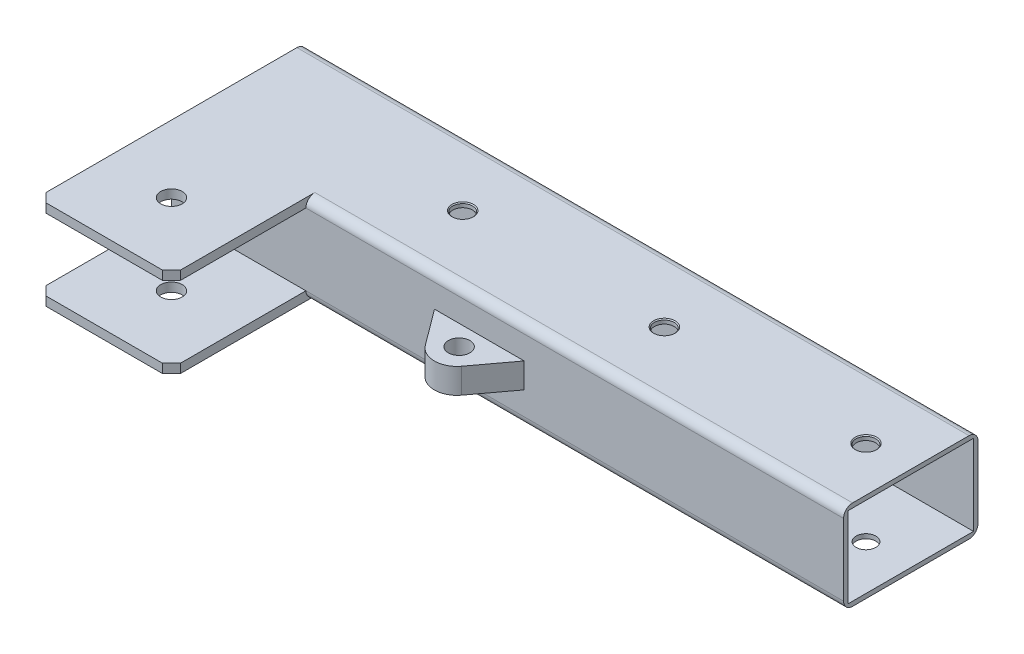
ISO-10303-21;
HEADER;
FILE_DESCRIPTION(('STEP AP214'),'2;1');
FILE_NAME('part.step','',(''),(''),'','','');
FILE_SCHEMA(('AUTOMOTIVE_DESIGN { 1 0 10303 214 1 1 1 1 }'));
ENDSEC;
DATA;
#1=APPLICATION_CONTEXT('core data for automotive mechanical design processes');
#2=APPLICATION_PROTOCOL_DEFINITION('international standard','automotive_design',2000,#1);
#3=PRODUCT_CONTEXT('',#1,'mechanical');
#4=PRODUCT('Part','Part','',(#3));
#5=PRODUCT_RELATED_PRODUCT_CATEGORY('part','',(#4));
#6=PRODUCT_DEFINITION_FORMATION('','',#4);
#7=PRODUCT_DEFINITION_CONTEXT('part definition',#1,'design');
#8=PRODUCT_DEFINITION('design','',#6,#7);
#9=PRODUCT_DEFINITION_SHAPE('','',#8);
#10=(LENGTH_UNIT() NAMED_UNIT(*) SI_UNIT(.MILLI.,.METRE.));
#11=(NAMED_UNIT(*) PLANE_ANGLE_UNIT() SI_UNIT($,.RADIAN.));
#12=(NAMED_UNIT(*) SI_UNIT($,.STERADIAN.) SOLID_ANGLE_UNIT());
#13=UNCERTAINTY_MEASURE_WITH_UNIT(LENGTH_MEASURE(1.E-05),#10,'distance_accuracy_value','');
#14=(GEOMETRIC_REPRESENTATION_CONTEXT(3) GLOBAL_UNCERTAINTY_ASSIGNED_CONTEXT((#13)) GLOBAL_UNIT_ASSIGNED_CONTEXT((#10,
#11,#12)) REPRESENTATION_CONTEXT('',''));
#15=CARTESIAN_POINT('',(0.,0.,0.));
#16=DIRECTION('',(0.,0.,1.));
#17=DIRECTION('',(1.,0.,0.));
#18=AXIS2_PLACEMENT_3D('',#15,#16,#17);
#19=CARTESIAN_POINT('',(-225.,100.,75.));
#20=DIRECTION('',(0.,0.,-1.));
#21=DIRECTION('',(-1.,0.,0.));
#22=AXIS2_PLACEMENT_3D('',#19,#20,#21);
#23=PLANE('',#22);
#24=DIRECTION('',(1.,0.,0.));
#25=VECTOR('',#24,1.);
#26=CARTESIAN_POINT('',(-375.001,10.,75.));
#27=LINE('',#26,#25);
#28=CARTESIAN_POINT('',(-375.,10.,75.));
#29=VERTEX_POINT('',#28);
#30=CARTESIAN_POINT('',(-225.,9.99999999999999,75.));
#31=VERTEX_POINT('',#30);
#32=EDGE_CURVE('E356',#29,#31,#27,.T.);
#33=ORIENTED_EDGE('',*,*,#32,.T.);
#34=DIRECTION('',(1.,0.,0.));
#35=VECTOR('',#34,1.);
#36=CARTESIAN_POINT('',(375.,9.99999999999999,75.));
#37=LINE('',#36,#35);
#38=CARTESIAN_POINT('',(375.,9.99999999999999,75.));
#39=VERTEX_POINT('',#38);
#40=EDGE_CURVE('E504',#31,#39,#37,.T.);
#41=ORIENTED_EDGE('',*,*,#40,.T.);
#42=DIRECTION('',(0.,-1.,0.));
#43=VECTOR('',#42,1.);
#44=CARTESIAN_POINT('',(375.,100.,75.));
#45=LINE('',#44,#43);
#46=CARTESIAN_POINT('',(375.,90.,75.));
#47=VERTEX_POINT('',#46);
#48=EDGE_CURVE('E448',#47,#39,#45,.T.);
#49=ORIENTED_EDGE('',*,*,#48,.F.);
#50=DIRECTION('',(1.,0.,0.));
#51=VECTOR('',#50,1.);
#52=CARTESIAN_POINT('',(-225.,90.,75.));
#53=LINE('',#52,#51);
#54=CARTESIAN_POINT('',(-225.,90.,75.));
#55=VERTEX_POINT('',#54);
#56=EDGE_CURVE('E500',#47,#55,#53,.F.);
#57=ORIENTED_EDGE('',*,*,#56,.T.);
#58=DIRECTION('',(1.,0.,0.));
#59=VECTOR('',#58,1.);
#60=CARTESIAN_POINT('',(-375.001,90.,75.));
#61=LINE('',#60,#59);
#62=CARTESIAN_POINT('',(-375.,90.,75.));
#63=VERTEX_POINT('',#62);
#64=EDGE_CURVE('E355',#63,#55,#61,.T.);
#65=ORIENTED_EDGE('',*,*,#64,.F.);
#66=DIRECTION('',(0.,1.,0.));
#67=VECTOR('',#66,1.);
#68=CARTESIAN_POINT('',(-375.,0.,75.));
#69=LINE('',#68,#67);
#70=EDGE_CURVE('E347',#29,#63,#69,.T.);
#71=ORIENTED_EDGE('',*,*,#70,.F.);
#72=EDGE_LOOP('',(#33,#41,#49,#57,#65,#71));
#73=FACE_BOUND('',#72,.T.);
#74=DIRECTION('',(1.,0.,0.));
#75=VECTOR('',#74,1.);
#76=CARTESIAN_POINT('',(0.,36.,75.));
#77=LINE('',#76,#75);
#78=CARTESIAN_POINT('',(-81.4569140668178,36.,75.));
#79=VERTEX_POINT('',#78);
#80=CARTESIAN_POINT('',(18.5430859331822,36.,75.));
#81=VERTEX_POINT('',#80);
#82=EDGE_CURVE('E236',#79,#81,#77,.T.);
#83=ORIENTED_EDGE('',*,*,#82,.F.);
#84=DIRECTION('',(0.,1.,0.));
#85=VECTOR('',#84,1.);
#86=CARTESIAN_POINT('',(-81.4569140668178,36.,75.));
#87=LINE('',#86,#85);
#88=CARTESIAN_POINT('',(-81.4569140668178,64.,75.));
#89=VERTEX_POINT('',#88);
#90=EDGE_CURVE('E250',#79,#89,#87,.T.);
#91=ORIENTED_EDGE('',*,*,#90,.T.);
#92=DIRECTION('',(1.,0.,0.));
#93=VECTOR('',#92,1.);
#94=CARTESIAN_POINT('',(0.,64.,75.));
#95=LINE('',#94,#93);
#96=CARTESIAN_POINT('',(18.5430859331822,64.,75.));
#97=VERTEX_POINT('',#96);
#98=EDGE_CURVE('E256',#89,#97,#95,.T.);
#99=ORIENTED_EDGE('',*,*,#98,.T.);
#100=DIRECTION('',(0.,1.,0.));
#101=VECTOR('',#100,1.);
#102=CARTESIAN_POINT('',(18.5430859331822,36.,75.));
#103=LINE('',#102,#101);
#104=EDGE_CURVE('E280',#81,#97,#103,.T.);
#105=ORIENTED_EDGE('',*,*,#104,.F.);
#106=EDGE_LOOP('',(#83,#91,#99,#105));
#107=FACE_BOUND('',#106,.T.);
#108=ADVANCED_FACE('F53',(#73,#107),#23,.F.);
#109=CARTESIAN_POINT('',(-375.,100.,225.));
#110=DIRECTION('',(0.,0.,-1.));
#111=DIRECTION('',(-1.,0.,0.));
#112=AXIS2_PLACEMENT_3D('',#109,#110,#111);
#113=PLANE('',#112);
#114=DIRECTION('',(1.,0.,0.));
#115=VECTOR('',#114,1.);
#116=CARTESIAN_POINT('',(-375.,100.,225.));
#117=LINE('',#116,#115);
#118=CARTESIAN_POINT('',(-365.,100.,225.));
#119=VERTEX_POINT('',#118);
#120=CARTESIAN_POINT('',(-235.,100.,225.));
#121=VERTEX_POINT('',#120);
#122=EDGE_CURVE('E442',#119,#121,#117,.T.);
#123=ORIENTED_EDGE('',*,*,#122,.F.);
#124=DIRECTION('',(0.,-1.,0.));
#125=VECTOR('',#124,1.);
#126=CARTESIAN_POINT('',(-365.,100.,225.));
#127=LINE('',#126,#125);
#128=CARTESIAN_POINT('',(-365.,90.,225.));
#129=VERTEX_POINT('',#128);
#130=EDGE_CURVE('E562',#119,#129,#127,.T.);
#131=ORIENTED_EDGE('',*,*,#130,.T.);
#132=DIRECTION('',(1.,0.,0.));
#133=VECTOR('',#132,1.);
#134=CARTESIAN_POINT('',(-375.001,90.,225.));
#135=LINE('',#134,#133);
#136=CARTESIAN_POINT('',(-235.,90.,225.));
#137=VERTEX_POINT('',#136);
#138=EDGE_CURVE('E365',#129,#137,#135,.T.);
#139=ORIENTED_EDGE('',*,*,#138,.T.);
#140=DIRECTION('',(0.,1.,0.));
#141=VECTOR('',#140,1.);
#142=CARTESIAN_POINT('',(-235.,100.,225.));
#143=LINE('',#142,#141);
#144=EDGE_CURVE('E559',#137,#121,#143,.T.);
#145=ORIENTED_EDGE('',*,*,#144,.T.);
#146=EDGE_LOOP('',(#123,#131,#139,#145));
#147=FACE_BOUND('',#146,.T.);
#148=ADVANCED_FACE('F584',(#147),#113,.F.);
#149=CARTESIAN_POINT('',(-225.,100.,75.));
#150=DIRECTION('',(-1.,0.,0.));
#151=DIRECTION('',(0.,0.,1.));
#152=AXIS2_PLACEMENT_3D('',#149,#150,#151);
#153=PLANE('',#152);
#154=DIRECTION('',(0.,0.,-1.));
#155=VECTOR('',#154,1.);
#156=CARTESIAN_POINT('',(-225.,100.,75.));
#157=LINE('',#156,#155);
#158=CARTESIAN_POINT('',(-225.,100.,215.));
#159=VERTEX_POINT('',#158);
#160=CARTESIAN_POINT('',(-225.,100.,65.));
#161=VERTEX_POINT('',#160);
#162=EDGE_CURVE('E445',#159,#161,#157,.T.);
#163=ORIENTED_EDGE('',*,*,#162,.F.);
#164=DIRECTION('',(0.,-1.,0.));
#165=VECTOR('',#164,1.);
#166=CARTESIAN_POINT('',(-225.,100.,215.));
#167=LINE('',#166,#165);
#168=CARTESIAN_POINT('',(-225.,90.,215.));
#169=VERTEX_POINT('',#168);
#170=EDGE_CURVE('E11',#159,#169,#167,.T.);
#171=ORIENTED_EDGE('',*,*,#170,.T.);
#172=DIRECTION('',(0.,0.,-1.));
#173=VECTOR('',#172,1.);
#174=CARTESIAN_POINT('',(-225.,90.,0.));
#175=LINE('',#174,#173);
#176=EDGE_CURVE('E375',#169,#55,#175,.T.);
#177=ORIENTED_EDGE('',*,*,#176,.T.);
#178=CARTESIAN_POINT('',(-225.,90.,65.));
#179=DIRECTION('',(-1.,0.,0.));
#180=DIRECTION('',(0.,0.,1.));
#181=AXIS2_PLACEMENT_3D('',#178,#179,#180);
#182=CIRCLE('',#181,10.);
#183=EDGE_CURVE('E526',#55,#161,#182,.T.);
#184=ORIENTED_EDGE('',*,*,#183,.T.);
#185=EDGE_LOOP('',(#163,#171,#177,#184));
#186=FACE_BOUND('',#185,.T.);
#187=ADVANCED_FACE('F623',(#186),#153,.F.);
#188=CARTESIAN_POINT('',(-300.,100.,150.));
#189=DIRECTION('',(0.,-1.,0.));
#190=DIRECTION('',(0.,0.,-1.));
#191=AXIS2_PLACEMENT_3D('',#188,#189,#190);
#192=CYLINDRICAL_SURFACE('',#191,12.);
#193=CARTESIAN_POINT('',(-300.,100.,150.));
#194=DIRECTION('',(0.,1.,0.));
#195=DIRECTION('',(0.,0.,1.));
#196=AXIS2_PLACEMENT_3D('',#193,#194,#195);
#197=CIRCLE('',#196,12.);
#198=CARTESIAN_POINT('',(-300.,100.,162.));
#199=VERTEX_POINT('',#198);
#200=EDGE_CURVE('E426',#199,#199,#197,.T.);
#201=ORIENTED_EDGE('',*,*,#200,.T.);
#202=EDGE_LOOP('',(#201));
#203=FACE_BOUND('',#202,.T.);
#204=CARTESIAN_POINT('',(-300.,90.,150.));
#205=DIRECTION('',(0.,-1.,0.));
#206=DIRECTION('',(0.,0.,-1.));
#207=AXIS2_PLACEMENT_3D('',#204,#205,#206);
#208=CIRCLE('',#207,12.);
#209=CARTESIAN_POINT('',(-300.,90.,138.));
#210=VERTEX_POINT('',#209);
#211=EDGE_CURVE('E360',#210,#210,#208,.F.);
#212=ORIENTED_EDGE('',*,*,#211,.F.);
#213=EDGE_LOOP('',(#212));
#214=FACE_BOUND('',#213,.T.);
#215=ADVANCED_FACE('F717',(#203,#214),#192,.F.);
#216=CARTESIAN_POINT('',(0.,100.,0.));
#217=DIRECTION('',(0.,-1.,0.));
#218=DIRECTION('',(0.,0.,-1.));
#219=AXIS2_PLACEMENT_3D('',#216,#217,#218);
#220=PLANE('',#219);
#221=CARTESIAN_POINT('',(100.,100.,0.));
#222=DIRECTION('',(0.,1.,0.));
#223=DIRECTION('',(0.,0.,1.));
#224=AXIS2_PLACEMENT_3D('',#221,#222,#223);
#225=CIRCLE('',#224,12.025);
#226=CARTESIAN_POINT('',(100.,100.,12.025));
#227=VERTEX_POINT('',#226);
#228=EDGE_CURVE('E279',#227,#227,#225,.T.);
#229=ORIENTED_EDGE('',*,*,#228,.F.);
#230=EDGE_LOOP('',(#229));
#231=FACE_BOUND('',#230,.T.);
#232=CARTESIAN_POINT('',(325.,100.,0.));
#233=DIRECTION('',(0.,1.,0.));
#234=DIRECTION('',(0.,0.,1.));
#235=AXIS2_PLACEMENT_3D('',#232,#233,#234);
#236=CIRCLE('',#235,12.025);
#237=CARTESIAN_POINT('',(325.,100.,12.025));
#238=VERTEX_POINT('',#237);
#239=EDGE_CURVE('E300',#238,#238,#236,.T.);
#240=ORIENTED_EDGE('',*,*,#239,.F.);
#241=EDGE_LOOP('',(#240));
#242=FACE_BOUND('',#241,.T.);
#243=CARTESIAN_POINT('',(-125.,100.,0.));
#244=DIRECTION('',(0.,1.,0.));
#245=DIRECTION('',(0.,0.,1.));
#246=AXIS2_PLACEMENT_3D('',#243,#244,#245);
#247=CIRCLE('',#246,12.025);
#248=CARTESIAN_POINT('',(-125.,100.,12.025));
#249=VERTEX_POINT('',#248);
#250=EDGE_CURVE('E320',#249,#249,#247,.T.);
#251=ORIENTED_EDGE('',*,*,#250,.F.);
#252=EDGE_LOOP('',(#251));
#253=FACE_BOUND('',#252,.T.);
#254=DIRECTION('',(0.,0.,1.));
#255=VECTOR('',#254,1.);
#256=CARTESIAN_POINT('',(-375.,100.,-75.));
#257=LINE('',#256,#255);
#258=CARTESIAN_POINT('',(-375.,100.,-65.));
#259=VERTEX_POINT('',#258);
#260=CARTESIAN_POINT('',(-375.,100.,215.));
#261=VERTEX_POINT('',#260);
#262=EDGE_CURVE('E437',#259,#261,#257,.T.);
#263=ORIENTED_EDGE('',*,*,#262,.T.);
#264=DIRECTION('',(-0.707106781186544,0.,-0.707106781186551));
#265=VECTOR('',#264,1.);
#266=CARTESIAN_POINT('',(-365.,100.,225.));
#267=LINE('',#266,#265);
#268=EDGE_CURVE('E64',#261,#119,#267,.F.);
#269=ORIENTED_EDGE('',*,*,#268,.T.);
#270=ORIENTED_EDGE('',*,*,#122,.T.);
#271=DIRECTION('',(-0.707106781186551,0.,0.707106781186544));
#272=VECTOR('',#271,1.);
#273=CARTESIAN_POINT('',(-225.,100.,215.));
#274=LINE('',#273,#272);
#275=EDGE_CURVE('E79',#121,#159,#274,.F.);
#276=ORIENTED_EDGE('',*,*,#275,.T.);
#277=ORIENTED_EDGE('',*,*,#162,.T.);
#278=DIRECTION('',(1.,0.,0.));
#279=VECTOR('',#278,1.);
#280=CARTESIAN_POINT('',(0.,100.,65.));
#281=LINE('',#280,#279);
#282=CARTESIAN_POINT('',(375.,100.,65.));
#283=VERTEX_POINT('',#282);
#284=EDGE_CURVE('E518',#161,#283,#281,.T.);
#285=ORIENTED_EDGE('',*,*,#284,.T.);
#286=DIRECTION('',(0.,0.,-1.));
#287=VECTOR('',#286,1.);
#288=CARTESIAN_POINT('',(375.,100.,75.));
#289=LINE('',#288,#287);
#290=CARTESIAN_POINT('',(375.,100.,-65.));
#291=VERTEX_POINT('',#290);
#292=EDGE_CURVE('E434',#283,#291,#289,.T.);
#293=ORIENTED_EDGE('',*,*,#292,.T.);
#294=DIRECTION('',(-1.,0.,0.));
#295=VECTOR('',#294,1.);
#296=CARTESIAN_POINT('',(0.,100.,-65.));
#297=LINE('',#296,#295);
#298=EDGE_CURVE('E496',#291,#259,#297,.T.);
#299=ORIENTED_EDGE('',*,*,#298,.T.);
#300=EDGE_LOOP('',(#263,#269,#270,#276,#277,#285,#293,#299));
#301=FACE_BOUND('',#300,.T.);
#302=ORIENTED_EDGE('',*,*,#200,.F.);
#303=EDGE_LOOP('',(#302));
#304=FACE_BOUND('',#303,.T.);
#305=ADVANCED_FACE('F577',(#231,#242,#253,#301,#304),#220,.F.);
#306=CARTESIAN_POINT('',(0.,0.,0.));
#307=DIRECTION('',(0.,-1.,0.));
#308=DIRECTION('',(0.,0.,-1.));
#309=AXIS2_PLACEMENT_3D('',#306,#307,#308);
#310=PLANE('',#309);
#311=CARTESIAN_POINT('',(100.,0.,0.));
#312=DIRECTION('',(0.,1.,0.));
#313=DIRECTION('',(0.,0.,1.));
#314=AXIS2_PLACEMENT_3D('',#311,#312,#313);
#315=CIRCLE('',#314,11.);
#316=CARTESIAN_POINT('',(100.,0.,11.));
#317=VERTEX_POINT('',#316);
#318=EDGE_CURVE('E292',#317,#317,#315,.T.);
#319=ORIENTED_EDGE('',*,*,#318,.T.);
#320=EDGE_LOOP('',(#319));
#321=FACE_BOUND('',#320,.T.);
#322=CARTESIAN_POINT('',(325.,0.,0.));
#323=DIRECTION('',(0.,1.,0.));
#324=DIRECTION('',(0.,0.,1.));
#325=AXIS2_PLACEMENT_3D('',#322,#323,#324);
#326=CIRCLE('',#325,11.);
#327=CARTESIAN_POINT('',(325.,0.,11.));
#328=VERTEX_POINT('',#327);
#329=EDGE_CURVE('E308',#328,#328,#326,.T.);
#330=ORIENTED_EDGE('',*,*,#329,.T.);
#331=EDGE_LOOP('',(#330));
#332=FACE_BOUND('',#331,.T.);
#333=CARTESIAN_POINT('',(-125.,0.,0.));
#334=DIRECTION('',(0.,1.,0.));
#335=DIRECTION('',(0.,0.,1.));
#336=AXIS2_PLACEMENT_3D('',#333,#334,#335);
#337=CIRCLE('',#336,11.);
#338=CARTESIAN_POINT('',(-125.,0.,11.));
#339=VERTEX_POINT('',#338);
#340=EDGE_CURVE('E328',#339,#339,#337,.T.);
#341=ORIENTED_EDGE('',*,*,#340,.T.);
#342=EDGE_LOOP('',(#341));
#343=FACE_BOUND('',#342,.T.);
#344=DIRECTION('',(0.,0.,-1.));
#345=VECTOR('',#344,1.);
#346=CARTESIAN_POINT('',(-225.,0.,75.));
#347=LINE('',#346,#345);
#348=CARTESIAN_POINT('',(-225.,0.,215.));
#349=VERTEX_POINT('',#348);
#350=CARTESIAN_POINT('',(-225.,0.,65.));
#351=VERTEX_POINT('',#350);
#352=EDGE_CURVE('E438',#349,#351,#347,.T.);
#353=ORIENTED_EDGE('',*,*,#352,.F.);
#354=DIRECTION('',(0.707106781186551,0.,-0.707106781186544));
#355=VECTOR('',#354,1.);
#356=CARTESIAN_POINT('',(-4.99999999999864,0.,-4.99999999999869));
#357=LINE('',#356,#355);
#358=CARTESIAN_POINT('',(-235.,0.,225.));
#359=VERTEX_POINT('',#358);
#360=EDGE_CURVE('E537',#349,#359,#357,.F.);
#361=ORIENTED_EDGE('',*,*,#360,.T.);
#362=DIRECTION('',(1.,0.,0.));
#363=VECTOR('',#362,1.);
#364=CARTESIAN_POINT('',(-375.,0.,225.));
#365=LINE('',#364,#363);
#366=CARTESIAN_POINT('',(-365.,0.,225.));
#367=VERTEX_POINT('',#366);
#368=EDGE_CURVE('E455',#367,#359,#365,.T.);
#369=ORIENTED_EDGE('',*,*,#368,.F.);
#370=DIRECTION('',(0.707106781186544,0.,0.707106781186551));
#371=VECTOR('',#370,1.);
#372=CARTESIAN_POINT('',(-295.000000000002,0.,294.999999999999));
#373=LINE('',#372,#371);
#374=CARTESIAN_POINT('',(-375.,0.,215.));
#375=VERTEX_POINT('',#374);
#376=EDGE_CURVE('E534',#367,#375,#373,.F.);
#377=ORIENTED_EDGE('',*,*,#376,.T.);
#378=DIRECTION('',(0.,0.,1.));
#379=VECTOR('',#378,1.);
#380=CARTESIAN_POINT('',(-375.,0.,75.));
#381=LINE('',#380,#379);
#382=CARTESIAN_POINT('',(-375.,0.,-65.));
#383=VERTEX_POINT('',#382);
#384=EDGE_CURVE('E451',#383,#375,#381,.T.);
#385=ORIENTED_EDGE('',*,*,#384,.F.);
#386=DIRECTION('',(-1.,0.,0.));
#387=VECTOR('',#386,1.);
#388=CARTESIAN_POINT('',(375.,0.,-65.));
#389=LINE('',#388,#387);
#390=CARTESIAN_POINT('',(375.,0.,-65.));
#391=VERTEX_POINT('',#390);
#392=EDGE_CURVE('E485',#383,#391,#389,.F.);
#393=ORIENTED_EDGE('',*,*,#392,.T.);
#394=DIRECTION('',(0.,0.,-1.));
#395=VECTOR('',#394,1.);
#396=CARTESIAN_POINT('',(375.,0.,75.));
#397=LINE('',#396,#395);
#398=CARTESIAN_POINT('',(375.,0.,65.));
#399=VERTEX_POINT('',#398);
#400=EDGE_CURVE('E430',#399,#391,#397,.T.);
#401=ORIENTED_EDGE('',*,*,#400,.F.);
#402=DIRECTION('',(1.,0.,0.));
#403=VECTOR('',#402,1.);
#404=CARTESIAN_POINT('',(-225.,0.,65.));
#405=LINE('',#404,#403);
#406=EDGE_CURVE('E514',#399,#351,#405,.F.);
#407=ORIENTED_EDGE('',*,*,#406,.T.);
#408=EDGE_LOOP('',(#353,#361,#369,#377,#385,#393,#401,#407));
#409=FACE_BOUND('',#408,.T.);
#410=CARTESIAN_POINT('',(-300.,0.,150.));
#411=DIRECTION('',(0.,1.,0.));
#412=DIRECTION('',(0.,0.,1.));
#413=AXIS2_PLACEMENT_3D('',#410,#411,#412);
#414=CIRCLE('',#413,12.);
#415=CARTESIAN_POINT('',(-300.,0.,162.));
#416=VERTEX_POINT('',#415);
#417=EDGE_CURVE('E416',#416,#416,#414,.T.);
#418=ORIENTED_EDGE('',*,*,#417,.T.);
#419=EDGE_LOOP('',(#418));
#420=FACE_BOUND('',#419,.T.);
#421=ADVANCED_FACE('F645',(#321,#332,#343,#409,#420),#310,.T.);
#422=CARTESIAN_POINT('',(375.,100.,75.));
#423=DIRECTION('',(-1.,0.,0.));
#424=DIRECTION('',(0.,0.,1.));
#425=AXIS2_PLACEMENT_3D('',#422,#423,#424);
#426=PLANE('',#425);
#427=DIRECTION('',(0.,1.,0.));
#428=VECTOR('',#427,1.);
#429=CARTESIAN_POINT('',(375.,0.,-70.));
#430=LINE('',#429,#428);
#431=CARTESIAN_POINT('',(375.,5.,-70.));
#432=VERTEX_POINT('',#431);
#433=CARTESIAN_POINT('',(375.,95.,-70.));
#434=VERTEX_POINT('',#433);
#435=EDGE_CURVE('E402',#432,#434,#430,.T.);
#436=ORIENTED_EDGE('',*,*,#435,.F.);
#437=DIRECTION('',(0.,0.,-1.));
#438=VECTOR('',#437,1.);
#439=CARTESIAN_POINT('',(375.,5.,0.));
#440=LINE('',#439,#438);
#441=CARTESIAN_POINT('',(375.,5.,70.));
#442=VERTEX_POINT('',#441);
#443=EDGE_CURVE('E382',#442,#432,#440,.T.);
#444=ORIENTED_EDGE('',*,*,#443,.F.);
#445=DIRECTION('',(0.,1.,0.));
#446=VECTOR('',#445,1.);
#447=CARTESIAN_POINT('',(375.,0.,70.));
#448=LINE('',#447,#446);
#449=CARTESIAN_POINT('',(375.,95.,70.));
#450=VERTEX_POINT('',#449);
#451=EDGE_CURVE('E388',#442,#450,#448,.T.);
#452=ORIENTED_EDGE('',*,*,#451,.T.);
#453=DIRECTION('',(0.,0.,-1.));
#454=VECTOR('',#453,1.);
#455=CARTESIAN_POINT('',(375.,95.,0.));
#456=LINE('',#455,#454);
#457=EDGE_CURVE('E406',#450,#434,#456,.T.);
#458=ORIENTED_EDGE('',*,*,#457,.T.);
#459=EDGE_LOOP('',(#436,#444,#452,#458));
#460=FACE_BOUND('',#459,.T.);
#461=ORIENTED_EDGE('',*,*,#48,.T.);
#462=CARTESIAN_POINT('',(375.,9.99999999999999,65.));
#463=DIRECTION('',(-1.,0.,0.));
#464=DIRECTION('',(0.,0.,1.));
#465=AXIS2_PLACEMENT_3D('',#462,#463,#464);
#466=CIRCLE('',#465,10.);
#467=EDGE_CURVE('E511',#39,#399,#466,.F.);
#468=ORIENTED_EDGE('',*,*,#467,.T.);
#469=ORIENTED_EDGE('',*,*,#400,.T.);
#470=CARTESIAN_POINT('',(375.,9.99999999999999,-65.));
#471=DIRECTION('',(-1.,0.,0.));
#472=DIRECTION('',(0.,0.,1.));
#473=AXIS2_PLACEMENT_3D('',#470,#471,#472);
#474=CIRCLE('',#473,10.);
#475=CARTESIAN_POINT('',(375.,9.99999999999999,-75.));
#476=VERTEX_POINT('',#475);
#477=EDGE_CURVE('E493',#391,#476,#474,.F.);
#478=ORIENTED_EDGE('',*,*,#477,.T.);
#479=DIRECTION('',(0.,-1.,0.));
#480=VECTOR('',#479,1.);
#481=CARTESIAN_POINT('',(375.,100.,-75.));
#482=LINE('',#481,#480);
#483=CARTESIAN_POINT('',(375.,90.,-75.));
#484=VERTEX_POINT('',#483);
#485=EDGE_CURVE('E468',#484,#476,#482,.T.);
#486=ORIENTED_EDGE('',*,*,#485,.F.);
#487=CARTESIAN_POINT('',(375.,90.,-65.));
#488=DIRECTION('',(-1.,0.,0.));
#489=DIRECTION('',(0.,0.,1.));
#490=AXIS2_PLACEMENT_3D('',#487,#488,#489);
#491=CIRCLE('',#490,10.);
#492=EDGE_CURVE('E489',#484,#291,#491,.F.);
#493=ORIENTED_EDGE('',*,*,#492,.T.);
#494=ORIENTED_EDGE('',*,*,#292,.F.);
#495=CARTESIAN_POINT('',(375.,90.,65.));
#496=DIRECTION('',(-1.,0.,0.));
#497=DIRECTION('',(0.,0.,1.));
#498=AXIS2_PLACEMENT_3D('',#495,#496,#497);
#499=CIRCLE('',#498,10.);
#500=EDGE_CURVE('E508',#283,#47,#499,.F.);
#501=ORIENTED_EDGE('',*,*,#500,.T.);
#502=EDGE_LOOP('',(#461,#468,#469,#478,#486,#493,#494,#501));
#503=FACE_BOUND('',#502,.T.);
#504=ADVANCED_FACE('F614',(#460,#503),#426,.F.);
#505=CARTESIAN_POINT('',(-375.,100.,-75.));
#506=DIRECTION('',(0.,0.,1.));
#507=DIRECTION('',(1.,0.,0.));
#508=AXIS2_PLACEMENT_3D('',#505,#506,#507);
#509=PLANE('',#508);
#510=ORIENTED_EDGE('',*,*,#485,.T.);
#511=DIRECTION('',(-1.,0.,0.));
#512=VECTOR('',#511,1.);
#513=CARTESIAN_POINT('',(-375.,9.99999999999999,-75.));
#514=LINE('',#513,#512);
#515=CARTESIAN_POINT('',(-375.,9.99999999999999,-75.));
#516=VERTEX_POINT('',#515);
#517=EDGE_CURVE('E475',#476,#516,#514,.T.);
#518=ORIENTED_EDGE('',*,*,#517,.T.);
#519=DIRECTION('',(0.,-1.,0.));
#520=VECTOR('',#519,1.);
#521=CARTESIAN_POINT('',(-375.,100.,-75.));
#522=LINE('',#521,#520);
#523=CARTESIAN_POINT('',(-375.,90.,-75.));
#524=VERTEX_POINT('',#523);
#525=EDGE_CURVE('E464',#524,#516,#522,.T.);
#526=ORIENTED_EDGE('',*,*,#525,.F.);
#527=DIRECTION('',(-1.,0.,0.));
#528=VECTOR('',#527,1.);
#529=CARTESIAN_POINT('',(-375.,90.,-75.));
#530=LINE('',#529,#528);
#531=EDGE_CURVE('E472',#524,#484,#530,.F.);
#532=ORIENTED_EDGE('',*,*,#531,.T.);
#533=EDGE_LOOP('',(#510,#518,#526,#532));
#534=FACE_BOUND('',#533,.T.);
#535=ADVANCED_FACE('F654',(#534),#509,.F.);
#536=CARTESIAN_POINT('',(-375.,100.,75.));
#537=DIRECTION('',(1.,0.,0.));
#538=DIRECTION('',(0.,0.,-1.));
#539=AXIS2_PLACEMENT_3D('',#536,#537,#538);
#540=PLANE('',#539);
#541=DIRECTION('',(0.,1.,0.));
#542=VECTOR('',#541,1.);
#543=CARTESIAN_POINT('',(-375.,0.,70.));
#544=LINE('',#543,#542);
#545=CARTESIAN_POINT('',(-375.,5.,70.));
#546=VERTEX_POINT('',#545);
#547=CARTESIAN_POINT('',(-375.,95.,70.));
#548=VERTEX_POINT('',#547);
#549=EDGE_CURVE('E396',#546,#548,#544,.T.);
#550=ORIENTED_EDGE('',*,*,#549,.F.);
#551=DIRECTION('',(0.,0.,-1.));
#552=VECTOR('',#551,1.);
#553=CARTESIAN_POINT('',(-375.,5.,0.));
#554=LINE('',#553,#552);
#555=CARTESIAN_POINT('',(-375.,5.,-70.));
#556=VERTEX_POINT('',#555);
#557=EDGE_CURVE('E383',#546,#556,#554,.T.);
#558=ORIENTED_EDGE('',*,*,#557,.T.);
#559=DIRECTION('',(0.,1.,0.));
#560=VECTOR('',#559,1.);
#561=CARTESIAN_POINT('',(-375.,0.,-70.));
#562=LINE('',#561,#560);
#563=CARTESIAN_POINT('',(-375.,95.,-70.));
#564=VERTEX_POINT('',#563);
#565=EDGE_CURVE('E387',#556,#564,#562,.T.);
#566=ORIENTED_EDGE('',*,*,#565,.T.);
#567=DIRECTION('',(0.,0.,-1.));
#568=VECTOR('',#567,1.);
#569=CARTESIAN_POINT('',(-375.,95.,0.));
#570=LINE('',#569,#568);
#571=EDGE_CURVE('E392',#548,#564,#570,.T.);
#572=ORIENTED_EDGE('',*,*,#571,.F.);
#573=EDGE_LOOP('',(#550,#558,#566,#572));
#574=FACE_BOUND('',#573,.T.);
#575=ORIENTED_EDGE('',*,*,#384,.T.);
#576=DIRECTION('',(0.,1.,0.));
#577=VECTOR('',#576,1.);
#578=CARTESIAN_POINT('',(-375.,100.,215.));
#579=LINE('',#578,#577);
#580=CARTESIAN_POINT('',(-375.,10.,215.));
#581=VERTEX_POINT('',#580);
#582=EDGE_CURVE('E556',#375,#581,#579,.T.);
#583=ORIENTED_EDGE('',*,*,#582,.T.);
#584=DIRECTION('',(0.,0.,1.));
#585=VECTOR('',#584,1.);
#586=CARTESIAN_POINT('',(-375.,9.99999999999999,0.));
#587=LINE('',#586,#585);
#588=EDGE_CURVE('E351',#29,#581,#587,.T.);
#589=ORIENTED_EDGE('',*,*,#588,.F.);
#590=ORIENTED_EDGE('',*,*,#70,.T.);
#591=DIRECTION('',(0.,0.,1.));
#592=VECTOR('',#591,1.);
#593=CARTESIAN_POINT('',(-375.,90.,0.));
#594=LINE('',#593,#592);
#595=CARTESIAN_POINT('',(-375.,90.,215.));
#596=VERTEX_POINT('',#595);
#597=EDGE_CURVE('E378',#63,#596,#594,.T.);
#598=ORIENTED_EDGE('',*,*,#597,.T.);
#599=DIRECTION('',(0.,1.,0.));
#600=VECTOR('',#599,1.);
#601=CARTESIAN_POINT('',(-375.,100.,215.));
#602=LINE('',#601,#600);
#603=EDGE_CURVE('E553',#596,#261,#602,.T.);
#604=ORIENTED_EDGE('',*,*,#603,.T.);
#605=ORIENTED_EDGE('',*,*,#262,.F.);
#606=CARTESIAN_POINT('',(-375.,90.,-65.));
#607=DIRECTION('',(1.,0.,0.));
#608=DIRECTION('',(0.,0.,-1.));
#609=AXIS2_PLACEMENT_3D('',#606,#607,#608);
#610=CIRCLE('',#609,10.);
#611=EDGE_CURVE('E479',#259,#524,#610,.F.);
#612=ORIENTED_EDGE('',*,*,#611,.T.);
#613=ORIENTED_EDGE('',*,*,#525,.T.);
#614=CARTESIAN_POINT('',(-375.,9.99999999999999,-65.));
#615=DIRECTION('',(1.,0.,0.));
#616=DIRECTION('',(0.,0.,-1.));
#617=AXIS2_PLACEMENT_3D('',#614,#615,#616);
#618=CIRCLE('',#617,10.);
#619=EDGE_CURVE('E482',#516,#383,#618,.F.);
#620=ORIENTED_EDGE('',*,*,#619,.T.);
#621=EDGE_LOOP('',(#575,#583,#589,#590,#598,#604,#605,#612,#613,#620));
#622=FACE_BOUND('',#621,.T.);
#623=ADVANCED_FACE('F592',(#574,#622),#540,.F.);
#624=ORIENTED_EDGE('',*,*,#368,.T.);
#625=DIRECTION('',(0.,1.,0.));
#626=VECTOR('',#625,1.);
#627=CARTESIAN_POINT('',(-235.,100.,225.));
#628=LINE('',#627,#626);
#629=CARTESIAN_POINT('',(-235.,10.,225.));
#630=VERTEX_POINT('',#629);
#631=EDGE_CURVE('E544',#359,#630,#628,.T.);
#632=ORIENTED_EDGE('',*,*,#631,.T.);
#633=DIRECTION('',(1.,0.,0.));
#634=VECTOR('',#633,1.);
#635=CARTESIAN_POINT('',(-375.001,10.,225.));
#636=LINE('',#635,#634);
#637=CARTESIAN_POINT('',(-365.,10.,225.));
#638=VERTEX_POINT('',#637);
#639=EDGE_CURVE('E361',#638,#630,#636,.T.);
#640=ORIENTED_EDGE('',*,*,#639,.F.);
#641=DIRECTION('',(0.,-1.,0.));
#642=VECTOR('',#641,1.);
#643=CARTESIAN_POINT('',(-365.,100.,225.));
#644=LINE('',#643,#642);
#645=EDGE_CURVE('E540',#638,#367,#644,.T.);
#646=ORIENTED_EDGE('',*,*,#645,.T.);
#647=EDGE_LOOP('',(#624,#632,#640,#646));
#648=FACE_BOUND('',#647,.T.);
#649=ADVANCED_FACE('F642',(#648),#113,.F.);
#650=DIRECTION('',(0.,0.,-1.));
#651=VECTOR('',#650,1.);
#652=CARTESIAN_POINT('',(-225.,9.99999999999999,0.));
#653=LINE('',#652,#651);
#654=CARTESIAN_POINT('',(-225.,10.,215.));
#655=VERTEX_POINT('',#654);
#656=EDGE_CURVE('E344',#655,#31,#653,.T.);
#657=ORIENTED_EDGE('',*,*,#656,.F.);
#658=DIRECTION('',(0.,-1.,0.));
#659=VECTOR('',#658,1.);
#660=CARTESIAN_POINT('',(-225.,100.,215.));
#661=LINE('',#660,#659);
#662=EDGE_CURVE('E530',#655,#349,#661,.T.);
#663=ORIENTED_EDGE('',*,*,#662,.T.);
#664=ORIENTED_EDGE('',*,*,#352,.T.);
#665=CARTESIAN_POINT('',(-225.,9.99999999999999,65.));
#666=DIRECTION('',(-1.,0.,0.));
#667=DIRECTION('',(0.,0.,1.));
#668=AXIS2_PLACEMENT_3D('',#665,#666,#667);
#669=CIRCLE('',#668,10.);
#670=EDGE_CURVE('E522',#351,#31,#669,.T.);
#671=ORIENTED_EDGE('',*,*,#670,.T.);
#672=EDGE_LOOP('',(#657,#663,#664,#671));
#673=FACE_BOUND('',#672,.T.);
#674=ADVANCED_FACE('F606',(#673),#153,.F.);
#675=CARTESIAN_POINT('',(-300.,10.,150.));
#676=DIRECTION('',(0.,-1.,0.));
#677=DIRECTION('',(0.,0.,-1.));
#678=AXIS2_PLACEMENT_3D('',#675,#676,#677);
#679=CIRCLE('',#678,12.);
#680=CARTESIAN_POINT('',(-300.,10.,138.));
#681=VERTEX_POINT('',#680);
#682=EDGE_CURVE('E340',#681,#681,#679,.F.);
#683=ORIENTED_EDGE('',*,*,#682,.T.);
#684=EDGE_LOOP('',(#683));
#685=FACE_BOUND('',#684,.T.);
#686=ORIENTED_EDGE('',*,*,#417,.F.);
#687=EDGE_LOOP('',(#686));
#688=FACE_BOUND('',#687,.T.);
#689=ADVANCED_FACE('F648',(#685,#688),#192,.F.);
#690=CARTESIAN_POINT('',(-375.,5.,0.));
#691=DIRECTION('',(0.,-1.,0.));
#692=DIRECTION('',(0.,0.,-1.));
#693=AXIS2_PLACEMENT_3D('',#690,#691,#692);
#694=PLANE('',#693);
#695=CARTESIAN_POINT('',(100.,5.,0.));
#696=DIRECTION('',(0.,-1.,0.));
#697=DIRECTION('',(0.,0.,-1.));
#698=AXIS2_PLACEMENT_3D('',#695,#696,#697);
#699=CIRCLE('',#698,11.);
#700=CARTESIAN_POINT('',(100.,5.,-11.));
#701=VERTEX_POINT('',#700);
#702=EDGE_CURVE('E296',#701,#701,#699,.T.);
#703=ORIENTED_EDGE('',*,*,#702,.T.);
#704=EDGE_LOOP('',(#703));
#705=FACE_BOUND('',#704,.T.);
#706=CARTESIAN_POINT('',(325.,5.,0.));
#707=DIRECTION('',(0.,-1.,0.));
#708=DIRECTION('',(0.,0.,-1.));
#709=AXIS2_PLACEMENT_3D('',#706,#707,#708);
#710=CIRCLE('',#709,11.);
#711=CARTESIAN_POINT('',(325.,5.,-11.));
#712=VERTEX_POINT('',#711);
#713=EDGE_CURVE('E312',#712,#712,#710,.T.);
#714=ORIENTED_EDGE('',*,*,#713,.T.);
#715=EDGE_LOOP('',(#714));
#716=FACE_BOUND('',#715,.T.);
#717=CARTESIAN_POINT('',(-125.,5.,0.));
#718=DIRECTION('',(0.,-1.,0.));
#719=DIRECTION('',(0.,0.,-1.));
#720=AXIS2_PLACEMENT_3D('',#717,#718,#719);
#721=CIRCLE('',#720,11.);
#722=CARTESIAN_POINT('',(-125.,5.,-11.));
#723=VERTEX_POINT('',#722);
#724=EDGE_CURVE('E332',#723,#723,#721,.T.);
#725=ORIENTED_EDGE('',*,*,#724,.T.);
#726=EDGE_LOOP('',(#725));
#727=FACE_BOUND('',#726,.T.);
#728=ORIENTED_EDGE('',*,*,#443,.T.);
#729=DIRECTION('',(1.,0.,0.));
#730=VECTOR('',#729,1.);
#731=CARTESIAN_POINT('',(-375.,5.,-70.));
#732=LINE('',#731,#730);
#733=EDGE_CURVE('E399',#556,#432,#732,.T.);
#734=ORIENTED_EDGE('',*,*,#733,.F.);
#735=ORIENTED_EDGE('',*,*,#557,.F.);
#736=DIRECTION('',(1.,0.,0.));
#737=VECTOR('',#736,1.);
#738=CARTESIAN_POINT('',(-375.,5.,70.));
#739=LINE('',#738,#737);
#740=EDGE_CURVE('E413',#546,#442,#739,.T.);
#741=ORIENTED_EDGE('',*,*,#740,.T.);
#742=EDGE_LOOP('',(#728,#734,#735,#741));
#743=FACE_BOUND('',#742,.T.);
#744=ADVANCED_FACE('F714',(#705,#716,#727,#743),#694,.F.);
#745=CARTESIAN_POINT('',(-375.,0.,70.));
#746=DIRECTION('',(0.,0.,-1.));
#747=DIRECTION('',(-1.,0.,0.));
#748=AXIS2_PLACEMENT_3D('',#745,#746,#747);
#749=PLANE('',#748);
#750=ORIENTED_EDGE('',*,*,#451,.F.);
#751=ORIENTED_EDGE('',*,*,#740,.F.);
#752=ORIENTED_EDGE('',*,*,#549,.T.);
#753=DIRECTION('',(1.,0.,0.));
#754=VECTOR('',#753,1.);
#755=CARTESIAN_POINT('',(-375.,95.,70.));
#756=LINE('',#755,#754);
#757=EDGE_CURVE('E417',#548,#450,#756,.T.);
#758=ORIENTED_EDGE('',*,*,#757,.T.);
#759=EDGE_LOOP('',(#750,#751,#752,#758));
#760=FACE_BOUND('',#759,.T.);
#761=ADVANCED_FACE('F721',(#760),#749,.T.);
#762=CARTESIAN_POINT('',(-375.,95.,0.));
#763=DIRECTION('',(0.,-1.,0.));
#764=DIRECTION('',(0.,0.,-1.));
#765=AXIS2_PLACEMENT_3D('',#762,#763,#764);
#766=PLANE('',#765);
#767=CARTESIAN_POINT('',(100.,95.,0.));
#768=DIRECTION('',(0.,-1.,0.));
#769=DIRECTION('',(0.,0.,-1.));
#770=AXIS2_PLACEMENT_3D('',#767,#768,#769);
#771=CIRCLE('',#770,11.);
#772=CARTESIAN_POINT('',(100.,95.,-11.));
#773=VERTEX_POINT('',#772);
#774=EDGE_CURVE('E58',#773,#773,#771,.T.);
#775=ORIENTED_EDGE('',*,*,#774,.F.);
#776=EDGE_LOOP('',(#775));
#777=FACE_BOUND('',#776,.T.);
#778=CARTESIAN_POINT('',(325.,95.,0.));
#779=DIRECTION('',(0.,-1.,0.));
#780=DIRECTION('',(0.,0.,-1.));
#781=AXIS2_PLACEMENT_3D('',#778,#779,#780);
#782=CIRCLE('',#781,11.);
#783=CARTESIAN_POINT('',(325.,95.,-11.));
#784=VERTEX_POINT('',#783);
#785=EDGE_CURVE('E316',#784,#784,#782,.T.);
#786=ORIENTED_EDGE('',*,*,#785,.F.);
#787=EDGE_LOOP('',(#786));
#788=FACE_BOUND('',#787,.T.);
#789=CARTESIAN_POINT('',(-125.,95.,0.));
#790=DIRECTION('',(0.,-1.,0.));
#791=DIRECTION('',(0.,0.,-1.));
#792=AXIS2_PLACEMENT_3D('',#789,#790,#791);
#793=CIRCLE('',#792,11.);
#794=CARTESIAN_POINT('',(-125.,95.,-11.));
#795=VERTEX_POINT('',#794);
#796=EDGE_CURVE('E336',#795,#795,#793,.T.);
#797=ORIENTED_EDGE('',*,*,#796,.F.);
#798=EDGE_LOOP('',(#797));
#799=FACE_BOUND('',#798,.T.);
#800=ORIENTED_EDGE('',*,*,#457,.F.);
#801=ORIENTED_EDGE('',*,*,#757,.F.);
#802=ORIENTED_EDGE('',*,*,#571,.T.);
#803=DIRECTION('',(1.,0.,0.));
#804=VECTOR('',#803,1.);
#805=CARTESIAN_POINT('',(-375.,95.,-70.));
#806=LINE('',#805,#804);
#807=EDGE_CURVE('E420',#564,#434,#806,.T.);
#808=ORIENTED_EDGE('',*,*,#807,.T.);
#809=EDGE_LOOP('',(#800,#801,#802,#808));
#810=FACE_BOUND('',#809,.T.);
#811=ADVANCED_FACE('F746',(#777,#788,#799,#810),#766,.T.);
#812=CARTESIAN_POINT('',(-375.,0.,-70.));
#813=DIRECTION('',(0.,0.,-1.));
#814=DIRECTION('',(-1.,0.,0.));
#815=AXIS2_PLACEMENT_3D('',#812,#813,#814);
#816=PLANE('',#815);
#817=ORIENTED_EDGE('',*,*,#435,.T.);
#818=ORIENTED_EDGE('',*,*,#807,.F.);
#819=ORIENTED_EDGE('',*,*,#565,.F.);
#820=ORIENTED_EDGE('',*,*,#733,.T.);
#821=EDGE_LOOP('',(#817,#818,#819,#820));
#822=FACE_BOUND('',#821,.T.);
#823=ADVANCED_FACE('F740',(#822),#816,.F.);
#824=CARTESIAN_POINT('',(-375.001,9.99999999999999,0.));
#825=DIRECTION('',(0.,-1.,0.));
#826=DIRECTION('',(0.,0.,-1.));
#827=AXIS2_PLACEMENT_3D('',#824,#825,#826);
#828=PLANE('',#827);
#829=ORIENTED_EDGE('',*,*,#682,.F.);
#830=EDGE_LOOP('',(#829));
#831=FACE_BOUND('',#830,.T.);
#832=ORIENTED_EDGE('',*,*,#639,.T.);
#833=DIRECTION('',(-0.707106781186551,0.,0.707106781186544));
#834=VECTOR('',#833,1.);
#835=CARTESIAN_POINT('',(-225.,10.,215.));
#836=LINE('',#835,#834);
#837=EDGE_CURVE('E550',#630,#655,#836,.F.);
#838=ORIENTED_EDGE('',*,*,#837,.T.);
#839=ORIENTED_EDGE('',*,*,#656,.T.);
#840=ORIENTED_EDGE('',*,*,#32,.F.);
#841=ORIENTED_EDGE('',*,*,#588,.T.);
#842=DIRECTION('',(-0.707106781186544,0.,-0.707106781186551));
#843=VECTOR('',#842,1.);
#844=CARTESIAN_POINT('',(-365.,10.,225.));
#845=LINE('',#844,#843);
#846=EDGE_CURVE('E547',#581,#638,#845,.F.);
#847=ORIENTED_EDGE('',*,*,#846,.T.);
#848=EDGE_LOOP('',(#832,#838,#839,#840,#841,#847));
#849=FACE_BOUND('',#848,.T.);
#850=ADVANCED_FACE('F599',(#831,#849),#828,.F.);
#851=CARTESIAN_POINT('',(-375.001,90.,0.));
#852=DIRECTION('',(0.,-1.,0.));
#853=DIRECTION('',(0.,0.,-1.));
#854=AXIS2_PLACEMENT_3D('',#851,#852,#853);
#855=PLANE('',#854);
#856=ORIENTED_EDGE('',*,*,#211,.T.);
#857=EDGE_LOOP('',(#856));
#858=FACE_BOUND('',#857,.T.);
#859=ORIENTED_EDGE('',*,*,#138,.F.);
#860=DIRECTION('',(0.707106781186544,0.,0.707106781186551));
#861=VECTOR('',#860,1.);
#862=CARTESIAN_POINT('',(-482.5005,90.,107.499499999999));
#863=LINE('',#862,#861);
#864=EDGE_CURVE('E569',#129,#596,#863,.F.);
#865=ORIENTED_EDGE('',*,*,#864,.T.);
#866=ORIENTED_EDGE('',*,*,#597,.F.);
#867=ORIENTED_EDGE('',*,*,#64,.T.);
#868=ORIENTED_EDGE('',*,*,#176,.F.);
#869=DIRECTION('',(0.707106781186551,0.,-0.707106781186544));
#870=VECTOR('',#869,1.);
#871=CARTESIAN_POINT('',(-192.500500000001,90.,182.500500000001));
#872=LINE('',#871,#870);
#873=EDGE_CURVE('E566',#169,#137,#872,.F.);
#874=ORIENTED_EDGE('',*,*,#873,.T.);
#875=EDGE_LOOP('',(#859,#865,#866,#867,#868,#874));
#876=FACE_BOUND('',#875,.T.);
#877=ADVANCED_FACE('F589',(#858,#876),#855,.T.);
#878=CARTESIAN_POINT('',(-375.,9.99999999999999,-65.));
#879=DIRECTION('',(1.,0.,0.));
#880=DIRECTION('',(0.,0.,-1.));
#881=AXIS2_PLACEMENT_3D('',#878,#879,#880);
#882=CYLINDRICAL_SURFACE('',#881,10.);
#883=ORIENTED_EDGE('',*,*,#477,.F.);
#884=ORIENTED_EDGE('',*,*,#392,.F.);
#885=ORIENTED_EDGE('',*,*,#619,.F.);
#886=ORIENTED_EDGE('',*,*,#517,.F.);
#887=EDGE_LOOP('',(#883,#884,#885,#886));
#888=FACE_BOUND('',#887,.T.);
#889=ADVANCED_FACE('F662',(#888),#882,.T.);
#890=CARTESIAN_POINT('',(0.,90.,-65.));
#891=DIRECTION('',(-1.,0.,0.));
#892=DIRECTION('',(0.,0.,1.));
#893=AXIS2_PLACEMENT_3D('',#890,#891,#892);
#894=CYLINDRICAL_SURFACE('',#893,10.);
#895=ORIENTED_EDGE('',*,*,#492,.F.);
#896=ORIENTED_EDGE('',*,*,#531,.F.);
#897=ORIENTED_EDGE('',*,*,#611,.F.);
#898=ORIENTED_EDGE('',*,*,#298,.F.);
#899=EDGE_LOOP('',(#895,#896,#897,#898));
#900=FACE_BOUND('',#899,.T.);
#901=ADVANCED_FACE('F665',(#900),#894,.T.);
#902=CARTESIAN_POINT('',(-225.,9.99999999999999,65.));
#903=DIRECTION('',(-1.,0.,0.));
#904=DIRECTION('',(0.,0.,1.));
#905=AXIS2_PLACEMENT_3D('',#902,#903,#904);
#906=CYLINDRICAL_SURFACE('',#905,10.);
#907=ORIENTED_EDGE('',*,*,#670,.F.);
#908=ORIENTED_EDGE('',*,*,#406,.F.);
#909=ORIENTED_EDGE('',*,*,#467,.F.);
#910=ORIENTED_EDGE('',*,*,#40,.F.);
#911=EDGE_LOOP('',(#907,#908,#909,#910));
#912=FACE_BOUND('',#911,.T.);
#913=ADVANCED_FACE('F610',(#912),#906,.T.);
#914=CARTESIAN_POINT('',(0.,90.,65.));
#915=DIRECTION('',(1.,0.,0.));
#916=DIRECTION('',(0.,0.,-1.));
#917=AXIS2_PLACEMENT_3D('',#914,#915,#916);
#918=CYLINDRICAL_SURFACE('',#917,10.);
#919=ORIENTED_EDGE('',*,*,#183,.F.);
#920=ORIENTED_EDGE('',*,*,#56,.F.);
#921=ORIENTED_EDGE('',*,*,#500,.F.);
#922=ORIENTED_EDGE('',*,*,#284,.F.);
#923=EDGE_LOOP('',(#919,#920,#921,#922));
#924=FACE_BOUND('',#923,.T.);
#925=ADVANCED_FACE('F620',(#924),#918,.T.);
#926=CARTESIAN_POINT('',(-225.,100.,215.));
#927=DIRECTION('',(-0.707106781186544,0.,-0.707106781186551));
#928=DIRECTION('',(0.,-1.,0.));
#929=AXIS2_PLACEMENT_3D('',#926,#927,#928);
#930=PLANE('',#929);
#931=ORIENTED_EDGE('',*,*,#837,.F.);
#932=ORIENTED_EDGE('',*,*,#631,.F.);
#933=ORIENTED_EDGE('',*,*,#360,.F.);
#934=ORIENTED_EDGE('',*,*,#662,.F.);
#935=EDGE_LOOP('',(#931,#932,#933,#934));
#936=FACE_BOUND('',#935,.T.);
#937=ADVANCED_FACE('F674',(#936),#930,.F.);
#938=CARTESIAN_POINT('',(-365.,100.,225.));
#939=DIRECTION('',(0.707106781186551,0.,-0.707106781186543));
#940=DIRECTION('',(0.,-1.,0.));
#941=AXIS2_PLACEMENT_3D('',#938,#939,#940);
#942=PLANE('',#941);
#943=ORIENTED_EDGE('',*,*,#846,.F.);
#944=ORIENTED_EDGE('',*,*,#582,.F.);
#945=ORIENTED_EDGE('',*,*,#376,.F.);
#946=ORIENTED_EDGE('',*,*,#645,.F.);
#947=EDGE_LOOP('',(#943,#944,#945,#946));
#948=FACE_BOUND('',#947,.T.);
#949=ADVANCED_FACE('F635',(#948),#942,.F.);
#950=CARTESIAN_POINT('',(-365.,100.,225.));
#951=DIRECTION('',(0.707106781186551,0.,-0.707106781186543));
#952=DIRECTION('',(0.,-1.,0.));
#953=AXIS2_PLACEMENT_3D('',#950,#951,#952);
#954=PLANE('',#953);
#955=ORIENTED_EDGE('',*,*,#268,.F.);
#956=ORIENTED_EDGE('',*,*,#603,.F.);
#957=ORIENTED_EDGE('',*,*,#864,.F.);
#958=ORIENTED_EDGE('',*,*,#130,.F.);
#959=EDGE_LOOP('',(#955,#956,#957,#958));
#960=FACE_BOUND('',#959,.T.);
#961=ADVANCED_FACE('F587',(#960),#954,.F.);
#962=CARTESIAN_POINT('',(-225.,100.,215.));
#963=DIRECTION('',(-0.707106781186544,0.,-0.707106781186551));
#964=DIRECTION('',(0.,-1.,0.));
#965=AXIS2_PLACEMENT_3D('',#962,#963,#964);
#966=PLANE('',#965);
#967=ORIENTED_EDGE('',*,*,#275,.F.);
#968=ORIENTED_EDGE('',*,*,#144,.F.);
#969=ORIENTED_EDGE('',*,*,#873,.F.);
#970=ORIENTED_EDGE('',*,*,#170,.F.);
#971=EDGE_LOOP('',(#967,#968,#969,#970));
#972=FACE_BOUND('',#971,.T.);
#973=ADVANCED_FACE('F56',(#972),#966,.F.);
#974=CARTESIAN_POINT('',(-125.,100.,0.));
#975=DIRECTION('',(0.,1.,0.));
#976=DIRECTION('',(0.,0.,1.));
#977=AXIS2_PLACEMENT_3D('',#974,#975,#976);
#978=CYLINDRICAL_SURFACE('',#977,11.);
#979=ORIENTED_EDGE('',*,*,#340,.F.);
#980=EDGE_LOOP('',(#979));
#981=FACE_BOUND('',#980,.T.);
#982=ORIENTED_EDGE('',*,*,#724,.F.);
#983=EDGE_LOOP('',(#982));
#984=FACE_BOUND('',#983,.T.);
#985=ADVANCED_FACE('F627',(#981,#984),#978,.F.);
#986=ORIENTED_EDGE('',*,*,#796,.T.);
#987=EDGE_LOOP('',(#986));
#988=FACE_BOUND('',#987,.T.);
#989=CARTESIAN_POINT('',(-125.,98.975,0.));
#990=DIRECTION('',(0.,1.,0.));
#991=DIRECTION('',(0.,0.,1.));
#992=AXIS2_PLACEMENT_3D('',#989,#990,#991);
#993=CIRCLE('',#992,11.);
#994=CARTESIAN_POINT('',(-125.,98.975,11.));
#995=VERTEX_POINT('',#994);
#996=EDGE_CURVE('E324',#995,#995,#993,.T.);
#997=ORIENTED_EDGE('',*,*,#996,.T.);
#998=EDGE_LOOP('',(#997));
#999=FACE_BOUND('',#998,.T.);
#1000=ADVANCED_FACE('F632',(#988,#999),#978,.F.);
#1001=CARTESIAN_POINT('',(-125.,100.,0.));
#1002=DIRECTION('',(0.,1.,0.));
#1003=DIRECTION('',(0.,0.,1.));
#1004=AXIS2_PLACEMENT_3D('',#1001,#1002,#1003);
#1005=CONICAL_SURFACE('',#1004,12.025,0.785398163397455);
#1006=ORIENTED_EDGE('',*,*,#996,.F.);
#1007=EDGE_LOOP('',(#1006));
#1008=FACE_BOUND('',#1007,.T.);
#1009=ORIENTED_EDGE('',*,*,#250,.T.);
#1010=EDGE_LOOP('',(#1009));
#1011=FACE_BOUND('',#1010,.T.);
#1012=ADVANCED_FACE('F858',(#1008,#1011),#1005,.F.);
#1013=CARTESIAN_POINT('',(325.,100.,0.));
#1014=DIRECTION('',(0.,1.,0.));
#1015=DIRECTION('',(0.,0.,1.));
#1016=AXIS2_PLACEMENT_3D('',#1013,#1014,#1015);
#1017=CYLINDRICAL_SURFACE('',#1016,11.);
#1018=ORIENTED_EDGE('',*,*,#329,.F.);
#1019=EDGE_LOOP('',(#1018));
#1020=FACE_BOUND('',#1019,.T.);
#1021=ORIENTED_EDGE('',*,*,#713,.F.);
#1022=EDGE_LOOP('',(#1021));
#1023=FACE_BOUND('',#1022,.T.);
#1024=ADVANCED_FACE('F871',(#1020,#1023),#1017,.F.);
#1025=ORIENTED_EDGE('',*,*,#785,.T.);
#1026=EDGE_LOOP('',(#1025));
#1027=FACE_BOUND('',#1026,.T.);
#1028=CARTESIAN_POINT('',(325.,98.975,0.));
#1029=DIRECTION('',(0.,1.,0.));
#1030=DIRECTION('',(0.,0.,1.));
#1031=AXIS2_PLACEMENT_3D('',#1028,#1029,#1030);
#1032=CIRCLE('',#1031,11.);
#1033=CARTESIAN_POINT('',(325.,98.975,11.));
#1034=VERTEX_POINT('',#1033);
#1035=EDGE_CURVE('E304',#1034,#1034,#1032,.T.);
#1036=ORIENTED_EDGE('',*,*,#1035,.T.);
#1037=EDGE_LOOP('',(#1036));
#1038=FACE_BOUND('',#1037,.T.);
#1039=ADVANCED_FACE('F883',(#1027,#1038),#1017,.F.);
#1040=CARTESIAN_POINT('',(325.,100.,0.));
#1041=DIRECTION('',(0.,1.,0.));
#1042=DIRECTION('',(0.,0.,1.));
#1043=AXIS2_PLACEMENT_3D('',#1040,#1041,#1042);
#1044=CONICAL_SURFACE('',#1043,12.025,0.785398163397448);
#1045=ORIENTED_EDGE('',*,*,#1035,.F.);
#1046=EDGE_LOOP('',(#1045));
#1047=FACE_BOUND('',#1046,.T.);
#1048=ORIENTED_EDGE('',*,*,#239,.T.);
#1049=EDGE_LOOP('',(#1048));
#1050=FACE_BOUND('',#1049,.T.);
#1051=ADVANCED_FACE('F894',(#1047,#1050),#1044,.F.);
#1052=CARTESIAN_POINT('',(100.,100.,0.));
#1053=DIRECTION('',(0.,1.,0.));
#1054=DIRECTION('',(0.,0.,1.));
#1055=AXIS2_PLACEMENT_3D('',#1052,#1053,#1054);
#1056=CYLINDRICAL_SURFACE('',#1055,11.);
#1057=ORIENTED_EDGE('',*,*,#774,.T.);
#1058=EDGE_LOOP('',(#1057));
#1059=FACE_BOUND('',#1058,.T.);
#1060=CARTESIAN_POINT('',(100.,98.975,0.));
#1061=DIRECTION('',(0.,1.,0.));
#1062=DIRECTION('',(0.,0.,1.));
#1063=AXIS2_PLACEMENT_3D('',#1060,#1061,#1062);
#1064=CIRCLE('',#1063,11.);
#1065=CARTESIAN_POINT('',(100.,98.975,11.));
#1066=VERTEX_POINT('',#1065);
#1067=EDGE_CURVE('E288',#1066,#1066,#1064,.T.);
#1068=ORIENTED_EDGE('',*,*,#1067,.T.);
#1069=EDGE_LOOP('',(#1068));
#1070=FACE_BOUND('',#1069,.T.);
#1071=ADVANCED_FACE('F905',(#1059,#1070),#1056,.F.);
#1072=CARTESIAN_POINT('',(100.,100.,0.));
#1073=DIRECTION('',(0.,1.,0.));
#1074=DIRECTION('',(0.,0.,1.));
#1075=AXIS2_PLACEMENT_3D('',#1072,#1073,#1074);
#1076=CONICAL_SURFACE('',#1075,12.025,0.785398163397455);
#1077=ORIENTED_EDGE('',*,*,#1067,.F.);
#1078=EDGE_LOOP('',(#1077));
#1079=FACE_BOUND('',#1078,.T.);
#1080=ORIENTED_EDGE('',*,*,#228,.T.);
#1081=EDGE_LOOP('',(#1080));
#1082=FACE_BOUND('',#1081,.T.);
#1083=ADVANCED_FACE('F917',(#1079,#1082),#1076,.F.);
#1084=ORIENTED_EDGE('',*,*,#318,.F.);
#1085=EDGE_LOOP('',(#1084));
#1086=FACE_BOUND('',#1085,.T.);
#1087=ORIENTED_EDGE('',*,*,#702,.F.);
#1088=EDGE_LOOP('',(#1087));
#1089=FACE_BOUND('',#1088,.T.);
#1090=ADVANCED_FACE('F920',(#1086,#1089),#1056,.F.);
#1091=CARTESIAN_POINT('',(-88.3704014938842,36.,65.7011053036439));
#1092=DIRECTION('',(-0.802506774015802,0.,0.596643006879953));
#1093=DIRECTION('',(0.596643006879953,0.,0.802506774015802));
#1094=AXIS2_PLACEMENT_3D('',#1091,#1092,#1093);
#1095=PLANE('',#1094);
#1096=DIRECTION('',(0.596643006879953,0.,0.802506774015802));
#1097=VECTOR('',#1096,1.);
#1098=CARTESIAN_POINT('',(-88.3704014938842,64.,65.7011053036439));
#1099=LINE('',#1098,#1097);
#1100=CARTESIAN_POINT('',(-51.7179498014168,64.,115.));
#1101=VERTEX_POINT('',#1100);
#1102=EDGE_CURVE('E267',#89,#1101,#1099,.T.);
#1103=ORIENTED_EDGE('',*,*,#1102,.F.);
#1104=ORIENTED_EDGE('',*,*,#90,.F.);
#1105=DIRECTION('',(0.596643006879953,0.,0.802506774015802));
#1106=VECTOR('',#1105,1.);
#1107=CARTESIAN_POINT('',(-88.3704014938842,36.,65.7011053036439));
#1108=LINE('',#1107,#1106);
#1109=CARTESIAN_POINT('',(-51.7179498014168,36.,115.));
#1110=VERTEX_POINT('',#1109);
#1111=EDGE_CURVE('E242',#79,#1110,#1108,.T.);
#1112=ORIENTED_EDGE('',*,*,#1111,.T.);
#1113=DIRECTION('',(0.,1.,0.));
#1114=VECTOR('',#1113,1.);
#1115=CARTESIAN_POINT('',(-51.7179498014168,36.,115.));
#1116=LINE('',#1115,#1114);
#1117=EDGE_CURVE('E225',#1110,#1101,#1116,.T.);
#1118=ORIENTED_EDGE('',*,*,#1117,.T.);
#1119=EDGE_LOOP('',(#1103,#1104,#1112,#1118));
#1120=FACE_BOUND('',#1119,.T.);
#1121=ADVANCED_FACE('F248',(#1120),#1095,.T.);
#1122=CARTESIAN_POINT('',(47.8528189437884,36.,35.5773318142005));
#1123=DIRECTION('',(0.802506774015802,0.,0.596643006879952));
#1124=DIRECTION('',(0.596643006879952,0.,-0.802506774015802));
#1125=AXIS2_PLACEMENT_3D('',#1122,#1123,#1124);
#1126=PLANE('',#1125);
#1127=DIRECTION('',(0.596643006879952,0.,-0.802506774015802));
#1128=VECTOR('',#1127,1.);
#1129=CARTESIAN_POINT('',(47.8528189437884,64.,35.5773318142005));
#1130=LINE('',#1129,#1128);
#1131=CARTESIAN_POINT('',(-11.1958783322187,64.,115.));
#1132=VERTEX_POINT('',#1131);
#1133=EDGE_CURVE('E71',#1132,#97,#1130,.T.);
#1134=ORIENTED_EDGE('',*,*,#1133,.F.);
#1135=DIRECTION('',(0.,1.,0.));
#1136=VECTOR('',#1135,1.);
#1137=CARTESIAN_POINT('',(-11.1958783322187,36.,115.));
#1138=LINE('',#1137,#1136);
#1139=CARTESIAN_POINT('',(-11.1958783322187,36.,115.));
#1140=VERTEX_POINT('',#1139);
#1141=EDGE_CURVE('E235',#1140,#1132,#1138,.T.);
#1142=ORIENTED_EDGE('',*,*,#1141,.F.);
#1143=DIRECTION('',(0.596643006879952,0.,-0.802506774015802));
#1144=VECTOR('',#1143,1.);
#1145=CARTESIAN_POINT('',(47.8528189437884,36.,35.5773318142005));
#1146=LINE('',#1145,#1144);
#1147=EDGE_CURVE('E245',#1140,#81,#1146,.T.);
#1148=ORIENTED_EDGE('',*,*,#1147,.T.);
#1149=ORIENTED_EDGE('',*,*,#104,.T.);
#1150=EDGE_LOOP('',(#1134,#1142,#1148,#1149));
#1151=FACE_BOUND('',#1150,.T.);
#1152=ADVANCED_FACE('F956',(#1151),#1126,.T.);
#1153=CARTESIAN_POINT('',(-31.4569140668177,36.,97.5333914364646));
#1154=DIRECTION('',(0.,1.,0.));
#1155=DIRECTION('',(0.,0.,1.));
#1156=AXIS2_PLACEMENT_3D('',#1153,#1154,#1155);
#1157=CYLINDRICAL_SURFACE('',#1156,12.);
#1158=CARTESIAN_POINT('',(-31.4569140668177,36.,97.5333914364646));
#1159=DIRECTION('',(0.,1.,0.));
#1160=DIRECTION('',(0.,0.,1.));
#1161=AXIS2_PLACEMENT_3D('',#1158,#1159,#1160);
#1162=CIRCLE('',#1161,12.);
#1163=CARTESIAN_POINT('',(-31.4569140668177,36.,109.533391436465));
#1164=VERTEX_POINT('',#1163);
#1165=EDGE_CURVE('E252',#1164,#1164,#1162,.T.);
#1166=ORIENTED_EDGE('',*,*,#1165,.F.);
#1167=EDGE_LOOP('',(#1166));
#1168=FACE_BOUND('',#1167,.T.);
#1169=CARTESIAN_POINT('',(-31.4569140668177,64.,97.5333914364646));
#1170=DIRECTION('',(0.,1.,0.));
#1171=DIRECTION('',(0.,0.,1.));
#1172=AXIS2_PLACEMENT_3D('',#1169,#1170,#1171);
#1173=CIRCLE('',#1172,12.);
#1174=CARTESIAN_POINT('',(-31.4569140668177,64.,109.533391436465));
#1175=VERTEX_POINT('',#1174);
#1176=EDGE_CURVE('E263',#1175,#1175,#1173,.T.);
#1177=ORIENTED_EDGE('',*,*,#1176,.T.);
#1178=EDGE_LOOP('',(#1177));
#1179=FACE_BOUND('',#1178,.T.);
#1180=ADVANCED_FACE('F965',(#1168,#1179),#1157,.F.);
#1181=CARTESIAN_POINT('',(-31.4569140668177,36.,99.9364445577187));
#1182=DIRECTION('',(0.,1.,0.));
#1183=DIRECTION('',(0.,0.,1.));
#1184=AXIS2_PLACEMENT_3D('',#1181,#1182,#1183);
#1185=CYLINDRICAL_SURFACE('',#1184,25.2471834389776);
#1186=CARTESIAN_POINT('',(-31.4569140668177,64.,99.9364445577187));
#1187=DIRECTION('',(0.,1.,0.));
#1188=DIRECTION('',(0.,0.,1.));
#1189=AXIS2_PLACEMENT_3D('',#1186,#1187,#1188);
#1190=CIRCLE('',#1189,25.2471834389776);
#1191=EDGE_CURVE('E229',#1101,#1132,#1190,.T.);
#1192=ORIENTED_EDGE('',*,*,#1191,.F.);
#1193=ORIENTED_EDGE('',*,*,#1117,.F.);
#1194=CARTESIAN_POINT('',(-31.4569140668177,36.,99.9364445577187));
#1195=DIRECTION('',(0.,1.,0.));
#1196=DIRECTION('',(0.,0.,1.));
#1197=AXIS2_PLACEMENT_3D('',#1194,#1195,#1196);
#1198=CIRCLE('',#1197,25.2471834389776);
#1199=EDGE_CURVE('E228',#1110,#1140,#1198,.T.);
#1200=ORIENTED_EDGE('',*,*,#1199,.T.);
#1201=ORIENTED_EDGE('',*,*,#1141,.T.);
#1202=EDGE_LOOP('',(#1192,#1193,#1200,#1201));
#1203=FACE_BOUND('',#1202,.T.);
#1204=ADVANCED_FACE('F227',(#1203),#1185,.T.);
#1205=CARTESIAN_POINT('',(0.,36.,0.));
#1206=DIRECTION('',(0.,1.,0.));
#1207=DIRECTION('',(0.,0.,1.));
#1208=AXIS2_PLACEMENT_3D('',#1205,#1206,#1207);
#1209=PLANE('',#1208);
#1210=ORIENTED_EDGE('',*,*,#1165,.T.);
#1211=EDGE_LOOP('',(#1210));
#1212=FACE_BOUND('',#1211,.T.);
#1213=ORIENTED_EDGE('',*,*,#1111,.F.);
#1214=ORIENTED_EDGE('',*,*,#82,.T.);
#1215=ORIENTED_EDGE('',*,*,#1147,.F.);
#1216=ORIENTED_EDGE('',*,*,#1199,.F.);
#1217=EDGE_LOOP('',(#1213,#1214,#1215,#1216));
#1218=FACE_BOUND('',#1217,.T.);
#1219=ADVANCED_FACE('F241',(#1212,#1218),#1209,.F.);
#1220=CARTESIAN_POINT('',(0.,64.,0.));
#1221=DIRECTION('',(0.,1.,0.));
#1222=DIRECTION('',(0.,0.,1.));
#1223=AXIS2_PLACEMENT_3D('',#1220,#1221,#1222);
#1224=PLANE('',#1223);
#1225=ORIENTED_EDGE('',*,*,#1176,.F.);
#1226=EDGE_LOOP('',(#1225));
#1227=FACE_BOUND('',#1226,.T.);
#1228=ORIENTED_EDGE('',*,*,#1102,.T.);
#1229=ORIENTED_EDGE('',*,*,#1191,.T.);
#1230=ORIENTED_EDGE('',*,*,#1133,.T.);
#1231=ORIENTED_EDGE('',*,*,#98,.F.);
#1232=EDGE_LOOP('',(#1228,#1229,#1230,#1231));
#1233=FACE_BOUND('',#1232,.T.);
#1234=ADVANCED_FACE('F995',(#1227,#1233),#1224,.T.);
#1235=CLOSED_SHELL('',(#108,#148,#187,#215,#305,#421,#504,#535,#623,#649,#674,#689,#744,#761,
#811,#823,#850,#877,#889,#901,#913,#925,#937,#949,#961,#973,#985,#1000,#1012,#1024,#1039,#1051,
#1071,#1083,#1090,#1121,#1152,#1180,#1204,#1219,#1234));
#1236=MANIFOLD_SOLID_BREP('B2',#1235);
#1237=ADVANCED_BREP_SHAPE_REPRESENTATION('',(#18,#1236),#14);
#1238=SHAPE_DEFINITION_REPRESENTATION(#9,#1237);
ENDSEC;
END-ISO-10303-21;
